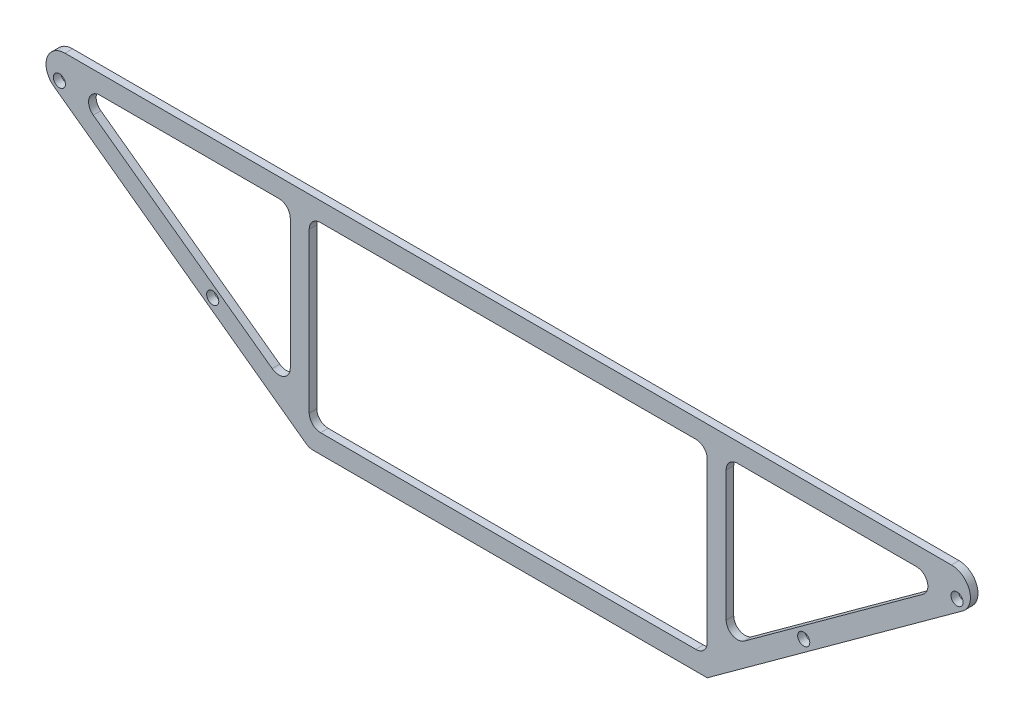
ISO-10303-21;
HEADER;
FILE_DESCRIPTION(('STEP AP214'),'2;1');
FILE_NAME('part.step','',(''),(''),'','','');
FILE_SCHEMA(('AUTOMOTIVE_DESIGN { 1 0 10303 214 1 1 1 1 }'));
ENDSEC;
DATA;
#1=APPLICATION_CONTEXT('core data for automotive mechanical design processes');
#2=APPLICATION_PROTOCOL_DEFINITION('international standard','automotive_design',2000,#1);
#3=PRODUCT_CONTEXT('',#1,'mechanical');
#4=PRODUCT('Part','Part','',(#3));
#5=PRODUCT_RELATED_PRODUCT_CATEGORY('part','',(#4));
#6=PRODUCT_DEFINITION_FORMATION('','',#4);
#7=PRODUCT_DEFINITION_CONTEXT('part definition',#1,'design');
#8=PRODUCT_DEFINITION('design','',#6,#7);
#9=PRODUCT_DEFINITION_SHAPE('','',#8);
#10=(LENGTH_UNIT() NAMED_UNIT(*) SI_UNIT(.MILLI.,.METRE.));
#11=(NAMED_UNIT(*) PLANE_ANGLE_UNIT() SI_UNIT($,.RADIAN.));
#12=(NAMED_UNIT(*) SI_UNIT($,.STERADIAN.) SOLID_ANGLE_UNIT());
#13=UNCERTAINTY_MEASURE_WITH_UNIT(LENGTH_MEASURE(1.E-05),#10,'distance_accuracy_value','');
#14=(GEOMETRIC_REPRESENTATION_CONTEXT(3) GLOBAL_UNCERTAINTY_ASSIGNED_CONTEXT((#13)) GLOBAL_UNIT_ASSIGNED_CONTEXT((#10,
#11,#12)) REPRESENTATION_CONTEXT('',''));
#15=CARTESIAN_POINT('',(0.,0.,0.));
#16=DIRECTION('',(0.,0.,1.));
#17=DIRECTION('',(1.,0.,0.));
#18=AXIS2_PLACEMENT_3D('',#15,#16,#17);
#19=CARTESIAN_POINT('',(-116.941733701452,23.9999999999999,2.));
#20=DIRECTION('',(0.,0.,1.));
#21=DIRECTION('',(1.,0.,0.));
#22=AXIS2_PLACEMENT_3D('',#19,#20,#21);
#23=PLANE('',#22);
#24=CARTESIAN_POINT('',(-118.411196832183,21.9774575140626,2.));
#25=DIRECTION('',(0.,0.,1.));
#26=DIRECTION('',(-1.,0.,0.));
#27=AXIS2_PLACEMENT_3D('',#24,#25,#26);
#28=CIRCLE('',#27,1.59999999999999);
#29=CARTESIAN_POINT('',(-120.011196832183,21.9774575140626,2.));
#30=VERTEX_POINT('',#29);
#31=EDGE_CURVE('E260',#30,#30,#28,.T.);
#32=ORIENTED_EDGE('',*,*,#31,.F.);
#33=EDGE_LOOP('',(#32));
#34=FACE_BOUND('',#33,.T.);
#35=CARTESIAN_POINT('',(118.411196832183,21.9774575140626,2.));
#36=DIRECTION('',(0.,0.,1.));
#37=DIRECTION('',(1.,0.,0.));
#38=AXIS2_PLACEMENT_3D('',#35,#36,#37);
#39=CIRCLE('',#38,1.59999999999999);
#40=CARTESIAN_POINT('',(120.011196832183,21.9774575140626,2.));
#41=VERTEX_POINT('',#40);
#42=EDGE_CURVE('E272',#41,#41,#39,.T.);
#43=ORIENTED_EDGE('',*,*,#42,.F.);
#44=EDGE_LOOP('',(#43));
#45=FACE_BOUND('',#44,.T.);
#46=DIRECTION('',(0.809016994374948,-0.587785252292472,0.));
#47=VECTOR('',#46,1.);
#48=CARTESIAN_POINT('',(-52.5,-29.,2.));
#49=LINE('',#48,#47);
#50=CARTESIAN_POINT('',(-119.880659962914,19.9549150281252,2.));
#51=VERTEX_POINT('',#50);
#52=CARTESIAN_POINT('',(-53.2885966681787,-28.4270509831249,2.));
#53=VERTEX_POINT('',#52);
#54=EDGE_CURVE('E348',#51,#53,#49,.T.);
#55=ORIENTED_EDGE('',*,*,#54,.T.);
#56=CARTESIAN_POINT('',(-51.5252409113013,-26.,2.));
#57=DIRECTION('',(0.,0.,1.));
#58=DIRECTION('',(1.,0.,0.));
#59=AXIS2_PLACEMENT_3D('',#56,#57,#58);
#60=CIRCLE('',#59,3.);
#61=CARTESIAN_POINT('',(-51.5252409113013,-29.,2.));
#62=VERTEX_POINT('',#61);
#63=EDGE_CURVE('E404',#53,#62,#60,.T.);
#64=ORIENTED_EDGE('',*,*,#63,.T.);
#65=DIRECTION('',(1.,0.,0.));
#66=VECTOR('',#65,1.);
#67=CARTESIAN_POINT('',(52.5,-29.,2.));
#68=LINE('',#67,#66);
#69=CARTESIAN_POINT('',(52.5,-29.,2.));
#70=VERTEX_POINT('',#69);
#71=EDGE_CURVE('E337',#62,#70,#68,.T.);
#72=ORIENTED_EDGE('',*,*,#71,.T.);
#73=DIRECTION('',(0.809016994374948,0.587785252292472,0.));
#74=VECTOR('',#73,1.);
#75=CARTESIAN_POINT('',(119.880659962914,19.9549150281252,2.));
#76=LINE('',#75,#74);
#77=CARTESIAN_POINT('',(119.880659962914,19.9549150281252,2.));
#78=VERTEX_POINT('',#77);
#79=EDGE_CURVE('E339',#70,#78,#76,.T.);
#80=ORIENTED_EDGE('',*,*,#79,.T.);
#81=CARTESIAN_POINT('',(116.941733701452,24.,2.));
#82=DIRECTION('',(0.,0.,1.));
#83=DIRECTION('',(-1.,0.,0.));
#84=AXIS2_PLACEMENT_3D('',#81,#82,#83);
#85=CIRCLE('',#84,4.99999999999999);
#86=CARTESIAN_POINT('',(116.941733701452,29.,2.));
#87=VERTEX_POINT('',#86);
#88=EDGE_CURVE('E342',#78,#87,#85,.T.);
#89=ORIENTED_EDGE('',*,*,#88,.T.);
#90=DIRECTION('',(-1.,0.,0.));
#91=VECTOR('',#90,1.);
#92=CARTESIAN_POINT('',(-116.941733701452,29.,2.));
#93=LINE('',#92,#91);
#94=CARTESIAN_POINT('',(-116.941733701452,29.,2.));
#95=VERTEX_POINT('',#94);
#96=EDGE_CURVE('E344',#87,#95,#93,.T.);
#97=ORIENTED_EDGE('',*,*,#96,.T.);
#98=CARTESIAN_POINT('',(-116.941733701452,23.9999999999999,2.));
#99=DIRECTION('',(0.,0.,1.));
#100=DIRECTION('',(1.,0.,0.));
#101=AXIS2_PLACEMENT_3D('',#98,#99,#100);
#102=CIRCLE('',#101,4.99999999999999);
#103=EDGE_CURVE('E346',#95,#51,#102,.T.);
#104=ORIENTED_EDGE('',*,*,#103,.T.);
#105=EDGE_LOOP('',(#55,#64,#72,#80,#89,#97,#104));
#106=FACE_BOUND('',#105,.T.);
#107=DIRECTION('',(1.,0.,0.));
#108=VECTOR('',#107,1.);
#109=CARTESIAN_POINT('',(52.5,-24.,2.));
#110=LINE('',#109,#108);
#111=CARTESIAN_POINT('',(-49.5,-24.,2.));
#112=VERTEX_POINT('',#111);
#113=CARTESIAN_POINT('',(49.5,-24.,2.));
#114=VERTEX_POINT('',#113);
#115=EDGE_CURVE('E316',#112,#114,#110,.T.);
#116=ORIENTED_EDGE('',*,*,#115,.F.);
#117=CARTESIAN_POINT('',(-49.5,-21.,2.));
#118=DIRECTION('',(0.,0.,1.));
#119=DIRECTION('',(1.,0.,0.));
#120=AXIS2_PLACEMENT_3D('',#117,#118,#119);
#121=CIRCLE('',#120,3.);
#122=CARTESIAN_POINT('',(-52.5,-21.,2.));
#123=VERTEX_POINT('',#122);
#124=EDGE_CURVE('E429',#112,#123,#121,.F.);
#125=ORIENTED_EDGE('',*,*,#124,.T.);
#126=DIRECTION('',(0.,-1.,0.));
#127=VECTOR('',#126,1.);
#128=CARTESIAN_POINT('',(-52.5,-24.,2.));
#129=LINE('',#128,#127);
#130=CARTESIAN_POINT('',(-52.5,21.,2.));
#131=VERTEX_POINT('',#130);
#132=EDGE_CURVE('E313',#131,#123,#129,.T.);
#133=ORIENTED_EDGE('',*,*,#132,.F.);
#134=CARTESIAN_POINT('',(-49.5,21.,2.));
#135=DIRECTION('',(0.,0.,1.));
#136=DIRECTION('',(1.,0.,0.));
#137=AXIS2_PLACEMENT_3D('',#134,#135,#136);
#138=CIRCLE('',#137,3.);
#139=CARTESIAN_POINT('',(-49.5,24.,2.));
#140=VERTEX_POINT('',#139);
#141=EDGE_CURVE('E433',#131,#140,#138,.F.);
#142=ORIENTED_EDGE('',*,*,#141,.T.);
#143=DIRECTION('',(-1.,0.,0.));
#144=VECTOR('',#143,1.);
#145=CARTESIAN_POINT('',(52.5,24.,2.));
#146=LINE('',#145,#144);
#147=CARTESIAN_POINT('',(49.5,24.,2.));
#148=VERTEX_POINT('',#147);
#149=EDGE_CURVE('E323',#148,#140,#146,.T.);
#150=ORIENTED_EDGE('',*,*,#149,.F.);
#151=CARTESIAN_POINT('',(49.5,21.,2.));
#152=DIRECTION('',(0.,0.,1.));
#153=DIRECTION('',(1.,0.,0.));
#154=AXIS2_PLACEMENT_3D('',#151,#152,#153);
#155=CIRCLE('',#154,3.);
#156=CARTESIAN_POINT('',(52.5,21.,2.));
#157=VERTEX_POINT('',#156);
#158=EDGE_CURVE('E425',#148,#157,#155,.F.);
#159=ORIENTED_EDGE('',*,*,#158,.T.);
#160=DIRECTION('',(0.,1.,0.));
#161=VECTOR('',#160,1.);
#162=CARTESIAN_POINT('',(52.5,-24.,2.));
#163=LINE('',#162,#161);
#164=CARTESIAN_POINT('',(52.5,-21.,2.));
#165=VERTEX_POINT('',#164);
#166=EDGE_CURVE('E320',#165,#157,#163,.T.);
#167=ORIENTED_EDGE('',*,*,#166,.F.);
#168=CARTESIAN_POINT('',(49.5,-21.,2.));
#169=DIRECTION('',(0.,0.,1.));
#170=DIRECTION('',(1.,0.,0.));
#171=AXIS2_PLACEMENT_3D('',#168,#169,#170);
#172=CIRCLE('',#171,3.);
#173=EDGE_CURVE('E421',#165,#114,#172,.F.);
#174=ORIENTED_EDGE('',*,*,#173,.T.);
#175=EDGE_LOOP('',(#116,#125,#133,#142,#150,#159,#167,#174));
#176=FACE_BOUND('',#175,.T.);
#177=CARTESIAN_POINT('',(60.5,21.,2.));
#178=DIRECTION('',(0.,0.,1.));
#179=DIRECTION('',(-1.,0.,0.));
#180=AXIS2_PLACEMENT_3D('',#177,#178,#179);
#181=CIRCLE('',#180,3.);
#182=CARTESIAN_POINT('',(60.5,24.,2.));
#183=VERTEX_POINT('',#182);
#184=CARTESIAN_POINT('',(57.5,21.,2.));
#185=VERTEX_POINT('',#184);
#186=EDGE_CURVE('E280',#183,#185,#181,.T.);
#187=ORIENTED_EDGE('',*,*,#186,.F.);
#188=DIRECTION('',(-1.,0.,0.));
#189=VECTOR('',#188,1.);
#190=CARTESIAN_POINT('',(116.941733701452,24.,2.));
#191=LINE('',#190,#189);
#192=CARTESIAN_POINT('',(107.708683089926,24.,2.));
#193=VERTEX_POINT('',#192);
#194=EDGE_CURVE('E278',#193,#183,#191,.T.);
#195=ORIENTED_EDGE('',*,*,#194,.F.);
#196=CARTESIAN_POINT('',(107.708683089926,21.,2.));
#197=DIRECTION('',(0.,0.,1.));
#198=DIRECTION('',(1.,0.,0.));
#199=AXIS2_PLACEMENT_3D('',#196,#197,#198);
#200=CIRCLE('',#199,3.);
#201=CARTESIAN_POINT('',(109.472038846804,18.5729490168751,2.));
#202=VERTEX_POINT('',#201);
#203=EDGE_CURVE('E417',#193,#202,#200,.F.);
#204=ORIENTED_EDGE('',*,*,#203,.T.);
#205=DIRECTION('',(0.809016994374948,0.587785252292472,0.));
#206=VECTOR('',#205,1.);
#207=CARTESIAN_POINT('',(62.2633557568774,-15.7261669390837,2.));
#208=LINE('',#207,#206);
#209=CARTESIAN_POINT('',(62.2633557568774,-15.7261669390837,2.));
#210=VERTEX_POINT('',#209);
#211=EDGE_CURVE('E288',#210,#202,#208,.T.);
#212=ORIENTED_EDGE('',*,*,#211,.F.);
#213=CARTESIAN_POINT('',(60.5,-13.2991159559589,2.));
#214=DIRECTION('',(0.,0.,1.));
#215=DIRECTION('',(1.,0.,0.));
#216=AXIS2_PLACEMENT_3D('',#213,#214,#215);
#217=CIRCLE('',#216,3.);
#218=CARTESIAN_POINT('',(57.5,-13.2991159559589,2.));
#219=VERTEX_POINT('',#218);
#220=EDGE_CURVE('E285',#219,#210,#217,.T.);
#221=ORIENTED_EDGE('',*,*,#220,.F.);
#222=DIRECTION('',(0.,-1.,0.));
#223=VECTOR('',#222,1.);
#224=CARTESIAN_POINT('',(57.5,21.,2.));
#225=LINE('',#224,#223);
#226=EDGE_CURVE('E283',#185,#219,#225,.T.);
#227=ORIENTED_EDGE('',*,*,#226,.F.);
#228=EDGE_LOOP('',(#187,#195,#204,#212,#221,#227));
#229=FACE_BOUND('',#228,.T.);
#230=CARTESIAN_POINT('',(77.9603471134358,-7.41180510056098,2.));
#231=DIRECTION('',(0.,0.,1.));
#232=DIRECTION('',(1.,0.,0.));
#233=AXIS2_PLACEMENT_3D('',#230,#231,#232);
#234=CIRCLE('',#233,1.59999999999995);
#235=CARTESIAN_POINT('',(79.5603471134357,-7.41180510056098,2.));
#236=VERTEX_POINT('',#235);
#237=EDGE_CURVE('E266',#236,#236,#234,.T.);
#238=ORIENTED_EDGE('',*,*,#237,.F.);
#239=EDGE_LOOP('',(#238));
#240=FACE_BOUND('',#239,.T.);
#241=CARTESIAN_POINT('',(-77.9603471134358,-7.411805100561,2.));
#242=DIRECTION('',(0.,0.,1.));
#243=DIRECTION('',(-1.,0.,0.));
#244=AXIS2_PLACEMENT_3D('',#241,#242,#243);
#245=CIRCLE('',#244,1.59999999999996);
#246=CARTESIAN_POINT('',(-79.5603471134357,-7.411805100561,2.));
#247=VERTEX_POINT('',#246);
#248=EDGE_CURVE('E254',#247,#247,#245,.T.);
#249=ORIENTED_EDGE('',*,*,#248,.F.);
#250=EDGE_LOOP('',(#249));
#251=FACE_BOUND('',#250,.T.);
#252=DIRECTION('',(0.809016994374948,-0.587785252292472,0.));
#253=VECTOR('',#252,1.);
#254=CARTESIAN_POINT('',(-62.2633557568774,-15.7261669390837,2.));
#255=LINE('',#254,#253);
#256=CARTESIAN_POINT('',(-109.472038846804,18.5729490168751,2.));
#257=VERTEX_POINT('',#256);
#258=CARTESIAN_POINT('',(-62.2633557568774,-15.7261669390837,2.));
#259=VERTEX_POINT('',#258);
#260=EDGE_CURVE('E209',#257,#259,#255,.T.);
#261=ORIENTED_EDGE('',*,*,#260,.F.);
#262=CARTESIAN_POINT('',(-107.708683089926,21.,2.));
#263=DIRECTION('',(0.,0.,1.));
#264=DIRECTION('',(1.,0.,0.));
#265=AXIS2_PLACEMENT_3D('',#262,#263,#264);
#266=CIRCLE('',#265,3.);
#267=CARTESIAN_POINT('',(-107.708683089926,23.9999999999999,2.));
#268=VERTEX_POINT('',#267);
#269=EDGE_CURVE('E11',#257,#268,#266,.F.);
#270=ORIENTED_EDGE('',*,*,#269,.T.);
#271=DIRECTION('',(-1.,0.,0.));
#272=VECTOR('',#271,1.);
#273=CARTESIAN_POINT('',(-116.941733701452,23.9999999999999,2.));
#274=LINE('',#273,#272);
#275=CARTESIAN_POINT('',(-60.5,24.,2.));
#276=VERTEX_POINT('',#275);
#277=EDGE_CURVE('E216',#276,#268,#274,.T.);
#278=ORIENTED_EDGE('',*,*,#277,.F.);
#279=CARTESIAN_POINT('',(-60.5,21.,2.));
#280=DIRECTION('',(0.,0.,1.));
#281=DIRECTION('',(1.,0.,0.));
#282=AXIS2_PLACEMENT_3D('',#279,#280,#281);
#283=CIRCLE('',#282,3.);
#284=CARTESIAN_POINT('',(-57.5,21.,2.));
#285=VERTEX_POINT('',#284);
#286=EDGE_CURVE('E231',#285,#276,#283,.T.);
#287=ORIENTED_EDGE('',*,*,#286,.F.);
#288=DIRECTION('',(0.,1.,0.));
#289=VECTOR('',#288,1.);
#290=CARTESIAN_POINT('',(-57.5,21.,2.));
#291=LINE('',#290,#289);
#292=CARTESIAN_POINT('',(-57.5,-13.2991159559589,2.));
#293=VERTEX_POINT('',#292);
#294=EDGE_CURVE('E229',#293,#285,#291,.T.);
#295=ORIENTED_EDGE('',*,*,#294,.F.);
#296=CARTESIAN_POINT('',(-60.5,-13.2991159559589,2.));
#297=DIRECTION('',(0.,0.,1.));
#298=DIRECTION('',(-1.,0.,0.));
#299=AXIS2_PLACEMENT_3D('',#296,#297,#298);
#300=CIRCLE('',#299,3.);
#301=EDGE_CURVE('E215',#259,#293,#300,.T.);
#302=ORIENTED_EDGE('',*,*,#301,.F.);
#303=EDGE_LOOP('',(#261,#270,#278,#287,#295,#302));
#304=FACE_BOUND('',#303,.T.);
#305=ADVANCED_FACE('F32',(#34,#45,#106,#176,#229,#240,#251,#304),#23,.T.);
#306=CARTESIAN_POINT('',(-116.941733701452,23.9999999999999,0.));
#307=DIRECTION('',(0.,0.,1.));
#308=DIRECTION('',(1.,0.,0.));
#309=AXIS2_PLACEMENT_3D('',#306,#307,#308);
#310=PLANE('',#309);
#311=CARTESIAN_POINT('',(-77.9603471134358,-7.411805100561,0.));
#312=DIRECTION('',(0.,0.,1.));
#313=DIRECTION('',(-1.,0.,0.));
#314=AXIS2_PLACEMENT_3D('',#311,#312,#313);
#315=CIRCLE('',#314,1.59999999999996);
#316=CARTESIAN_POINT('',(-79.5603471134357,-7.411805100561,0.));
#317=VERTEX_POINT('',#316);
#318=EDGE_CURVE('E223',#317,#317,#315,.T.);
#319=ORIENTED_EDGE('',*,*,#318,.T.);
#320=EDGE_LOOP('',(#319));
#321=FACE_BOUND('',#320,.T.);
#322=CARTESIAN_POINT('',(-118.411196832183,21.9774575140626,0.));
#323=DIRECTION('',(0.,0.,1.));
#324=DIRECTION('',(-1.,0.,0.));
#325=AXIS2_PLACEMENT_3D('',#322,#323,#324);
#326=CIRCLE('',#325,1.59999999999999);
#327=CARTESIAN_POINT('',(-120.011196832183,21.9774575140626,0.));
#328=VERTEX_POINT('',#327);
#329=EDGE_CURVE('E257',#328,#328,#326,.T.);
#330=ORIENTED_EDGE('',*,*,#329,.T.);
#331=EDGE_LOOP('',(#330));
#332=FACE_BOUND('',#331,.T.);
#333=CARTESIAN_POINT('',(77.9603471134358,-7.41180510056098,0.));
#334=DIRECTION('',(0.,0.,1.));
#335=DIRECTION('',(1.,0.,0.));
#336=AXIS2_PLACEMENT_3D('',#333,#334,#335);
#337=CIRCLE('',#336,1.59999999999995);
#338=CARTESIAN_POINT('',(79.5603471134357,-7.41180510056098,0.));
#339=VERTEX_POINT('',#338);
#340=EDGE_CURVE('E263',#339,#339,#337,.T.);
#341=ORIENTED_EDGE('',*,*,#340,.T.);
#342=EDGE_LOOP('',(#341));
#343=FACE_BOUND('',#342,.T.);
#344=CARTESIAN_POINT('',(118.411196832183,21.9774575140626,0.));
#345=DIRECTION('',(0.,0.,1.));
#346=DIRECTION('',(1.,0.,0.));
#347=AXIS2_PLACEMENT_3D('',#344,#345,#346);
#348=CIRCLE('',#347,1.59999999999999);
#349=CARTESIAN_POINT('',(120.011196832183,21.9774575140626,0.));
#350=VERTEX_POINT('',#349);
#351=EDGE_CURVE('E269',#350,#350,#348,.T.);
#352=ORIENTED_EDGE('',*,*,#351,.T.);
#353=EDGE_LOOP('',(#352));
#354=FACE_BOUND('',#353,.T.);
#355=DIRECTION('',(0.809016994374948,0.587785252292472,0.));
#356=VECTOR('',#355,1.);
#357=CARTESIAN_POINT('',(62.2633557568774,-15.7261669390837,0.));
#358=LINE('',#357,#356);
#359=CARTESIAN_POINT('',(62.2633557568774,-15.7261669390837,0.));
#360=VERTEX_POINT('',#359);
#361=CARTESIAN_POINT('',(109.472038846804,18.5729490168751,0.));
#362=VERTEX_POINT('',#361);
#363=EDGE_CURVE('E281',#360,#362,#358,.T.);
#364=ORIENTED_EDGE('',*,*,#363,.T.);
#365=CARTESIAN_POINT('',(107.708683089926,21.,0.));
#366=DIRECTION('',(0.,0.,1.));
#367=DIRECTION('',(1.,0.,0.));
#368=AXIS2_PLACEMENT_3D('',#365,#366,#367);
#369=CIRCLE('',#368,3.);
#370=CARTESIAN_POINT('',(107.708683089926,24.,0.));
#371=VERTEX_POINT('',#370);
#372=EDGE_CURVE('E415',#362,#371,#369,.T.);
#373=ORIENTED_EDGE('',*,*,#372,.T.);
#374=DIRECTION('',(-1.,0.,0.));
#375=VECTOR('',#374,1.);
#376=CARTESIAN_POINT('',(116.941733701452,24.,0.));
#377=LINE('',#376,#375);
#378=CARTESIAN_POINT('',(60.5,24.,0.));
#379=VERTEX_POINT('',#378);
#380=EDGE_CURVE('E275',#371,#379,#377,.T.);
#381=ORIENTED_EDGE('',*,*,#380,.T.);
#382=CARTESIAN_POINT('',(60.5,21.,0.));
#383=DIRECTION('',(0.,0.,1.));
#384=DIRECTION('',(-1.,0.,0.));
#385=AXIS2_PLACEMENT_3D('',#382,#383,#384);
#386=CIRCLE('',#385,3.);
#387=CARTESIAN_POINT('',(57.5,21.,0.));
#388=VERTEX_POINT('',#387);
#389=EDGE_CURVE('E293',#379,#388,#386,.T.);
#390=ORIENTED_EDGE('',*,*,#389,.T.);
#391=DIRECTION('',(0.,-1.,0.));
#392=VECTOR('',#391,1.);
#393=CARTESIAN_POINT('',(57.5,21.,0.));
#394=LINE('',#393,#392);
#395=CARTESIAN_POINT('',(57.5,-13.2991159559589,0.));
#396=VERTEX_POINT('',#395);
#397=EDGE_CURVE('E296',#388,#396,#394,.T.);
#398=ORIENTED_EDGE('',*,*,#397,.T.);
#399=CARTESIAN_POINT('',(60.5,-13.2991159559589,0.));
#400=DIRECTION('',(0.,0.,1.));
#401=DIRECTION('',(1.,0.,0.));
#402=AXIS2_PLACEMENT_3D('',#399,#400,#401);
#403=CIRCLE('',#402,3.);
#404=EDGE_CURVE('E299',#396,#360,#403,.T.);
#405=ORIENTED_EDGE('',*,*,#404,.T.);
#406=EDGE_LOOP('',(#364,#373,#381,#390,#398,#405));
#407=FACE_BOUND('',#406,.T.);
#408=DIRECTION('',(1.,0.,0.));
#409=VECTOR('',#408,1.);
#410=CARTESIAN_POINT('',(52.5,-29.,0.));
#411=LINE('',#410,#409);
#412=CARTESIAN_POINT('',(-51.5252409113013,-29.,0.));
#413=VERTEX_POINT('',#412);
#414=CARTESIAN_POINT('',(52.5,-29.,0.));
#415=VERTEX_POINT('',#414);
#416=EDGE_CURVE('E326',#413,#415,#411,.T.);
#417=ORIENTED_EDGE('',*,*,#416,.F.);
#418=CARTESIAN_POINT('',(-51.5252409113013,-26.,0.));
#419=DIRECTION('',(0.,0.,1.));
#420=DIRECTION('',(1.,0.,0.));
#421=AXIS2_PLACEMENT_3D('',#418,#419,#420);
#422=CIRCLE('',#421,3.);
#423=CARTESIAN_POINT('',(-53.2885966681787,-28.4270509831249,0.));
#424=VERTEX_POINT('',#423);
#425=EDGE_CURVE('E400',#413,#424,#422,.F.);
#426=ORIENTED_EDGE('',*,*,#425,.T.);
#427=DIRECTION('',(0.809016994374948,-0.587785252292472,0.));
#428=VECTOR('',#427,1.);
#429=CARTESIAN_POINT('',(-52.5,-29.,0.));
#430=LINE('',#429,#428);
#431=CARTESIAN_POINT('',(-119.880659962914,19.9549150281252,0.));
#432=VERTEX_POINT('',#431);
#433=EDGE_CURVE('E340',#432,#424,#430,.T.);
#434=ORIENTED_EDGE('',*,*,#433,.F.);
#435=CARTESIAN_POINT('',(-116.941733701452,23.9999999999999,0.));
#436=DIRECTION('',(0.,0.,1.));
#437=DIRECTION('',(1.,0.,0.));
#438=AXIS2_PLACEMENT_3D('',#435,#436,#437);
#439=CIRCLE('',#438,4.99999999999999);
#440=CARTESIAN_POINT('',(-116.941733701452,29.,0.));
#441=VERTEX_POINT('',#440);
#442=EDGE_CURVE('E359',#441,#432,#439,.T.);
#443=ORIENTED_EDGE('',*,*,#442,.F.);
#444=DIRECTION('',(-1.,0.,0.));
#445=VECTOR('',#444,1.);
#446=CARTESIAN_POINT('',(-116.941733701452,29.,0.));
#447=LINE('',#446,#445);
#448=CARTESIAN_POINT('',(116.941733701452,29.,0.));
#449=VERTEX_POINT('',#448);
#450=EDGE_CURVE('E357',#449,#441,#447,.T.);
#451=ORIENTED_EDGE('',*,*,#450,.F.);
#452=CARTESIAN_POINT('',(116.941733701452,24.,0.));
#453=DIRECTION('',(0.,0.,1.));
#454=DIRECTION('',(-1.,0.,0.));
#455=AXIS2_PLACEMENT_3D('',#452,#453,#454);
#456=CIRCLE('',#455,4.99999999999999);
#457=CARTESIAN_POINT('',(119.880659962914,19.9549150281252,0.));
#458=VERTEX_POINT('',#457);
#459=EDGE_CURVE('E355',#458,#449,#456,.T.);
#460=ORIENTED_EDGE('',*,*,#459,.F.);
#461=DIRECTION('',(0.809016994374948,0.587785252292472,0.));
#462=VECTOR('',#461,1.);
#463=CARTESIAN_POINT('',(119.880659962914,19.9549150281252,0.));
#464=LINE('',#463,#462);
#465=EDGE_CURVE('E353',#415,#458,#464,.T.);
#466=ORIENTED_EDGE('',*,*,#465,.F.);
#467=EDGE_LOOP('',(#417,#426,#434,#443,#451,#460,#466));
#468=FACE_BOUND('',#467,.T.);
#469=DIRECTION('',(-1.,0.,0.));
#470=VECTOR('',#469,1.);
#471=CARTESIAN_POINT('',(52.5,24.,0.));
#472=LINE('',#471,#470);
#473=CARTESIAN_POINT('',(49.5,24.,0.));
#474=VERTEX_POINT('',#473);
#475=CARTESIAN_POINT('',(-49.5,24.,0.));
#476=VERTEX_POINT('',#475);
#477=EDGE_CURVE('E317',#474,#476,#472,.T.);
#478=ORIENTED_EDGE('',*,*,#477,.T.);
#479=CARTESIAN_POINT('',(-49.5,21.,0.));
#480=DIRECTION('',(0.,0.,1.));
#481=DIRECTION('',(1.,0.,0.));
#482=AXIS2_PLACEMENT_3D('',#479,#480,#481);
#483=CIRCLE('',#482,3.);
#484=CARTESIAN_POINT('',(-52.5,21.,0.));
#485=VERTEX_POINT('',#484);
#486=EDGE_CURVE('E431',#476,#485,#483,.T.);
#487=ORIENTED_EDGE('',*,*,#486,.T.);
#488=DIRECTION('',(0.,-1.,0.));
#489=VECTOR('',#488,1.);
#490=CARTESIAN_POINT('',(-52.5,-24.,0.));
#491=LINE('',#490,#489);
#492=CARTESIAN_POINT('',(-52.5,-21.,0.));
#493=VERTEX_POINT('',#492);
#494=EDGE_CURVE('E312',#485,#493,#491,.T.);
#495=ORIENTED_EDGE('',*,*,#494,.T.);
#496=CARTESIAN_POINT('',(-49.5,-21.,0.));
#497=DIRECTION('',(0.,0.,1.));
#498=DIRECTION('',(1.,0.,0.));
#499=AXIS2_PLACEMENT_3D('',#496,#497,#498);
#500=CIRCLE('',#499,3.);
#501=CARTESIAN_POINT('',(-49.5,-24.,0.));
#502=VERTEX_POINT('',#501);
#503=EDGE_CURVE('E427',#493,#502,#500,.T.);
#504=ORIENTED_EDGE('',*,*,#503,.T.);
#505=DIRECTION('',(1.,0.,0.));
#506=VECTOR('',#505,1.);
#507=CARTESIAN_POINT('',(52.5,-24.,0.));
#508=LINE('',#507,#506);
#509=CARTESIAN_POINT('',(49.5,-24.,0.));
#510=VERTEX_POINT('',#509);
#511=EDGE_CURVE('E329',#502,#510,#508,.T.);
#512=ORIENTED_EDGE('',*,*,#511,.T.);
#513=CARTESIAN_POINT('',(49.5,-21.,0.));
#514=DIRECTION('',(0.,0.,1.));
#515=DIRECTION('',(1.,0.,0.));
#516=AXIS2_PLACEMENT_3D('',#513,#514,#515);
#517=CIRCLE('',#516,3.);
#518=CARTESIAN_POINT('',(52.5,-21.,0.));
#519=VERTEX_POINT('',#518);
#520=EDGE_CURVE('E419',#510,#519,#517,.T.);
#521=ORIENTED_EDGE('',*,*,#520,.T.);
#522=DIRECTION('',(0.,1.,0.));
#523=VECTOR('',#522,1.);
#524=CARTESIAN_POINT('',(52.5,-24.,0.));
#525=LINE('',#524,#523);
#526=CARTESIAN_POINT('',(52.5,21.,0.));
#527=VERTEX_POINT('',#526);
#528=EDGE_CURVE('E332',#519,#527,#525,.T.);
#529=ORIENTED_EDGE('',*,*,#528,.T.);
#530=CARTESIAN_POINT('',(49.5,21.,0.));
#531=DIRECTION('',(0.,0.,1.));
#532=DIRECTION('',(1.,0.,0.));
#533=AXIS2_PLACEMENT_3D('',#530,#531,#532);
#534=CIRCLE('',#533,3.);
#535=EDGE_CURVE('E423',#527,#474,#534,.T.);
#536=ORIENTED_EDGE('',*,*,#535,.T.);
#537=EDGE_LOOP('',(#478,#487,#495,#504,#512,#521,#529,#536));
#538=FACE_BOUND('',#537,.T.);
#539=DIRECTION('',(-1.,0.,0.));
#540=VECTOR('',#539,1.);
#541=CARTESIAN_POINT('',(-116.941733701452,23.9999999999999,0.));
#542=LINE('',#541,#540);
#543=CARTESIAN_POINT('',(-60.5,24.,0.));
#544=VERTEX_POINT('',#543);
#545=CARTESIAN_POINT('',(-107.708683089926,23.9999999999999,0.));
#546=VERTEX_POINT('',#545);
#547=EDGE_CURVE('E237',#544,#546,#542,.T.);
#548=ORIENTED_EDGE('',*,*,#547,.T.);
#549=CARTESIAN_POINT('',(-107.708683089926,21.,0.));
#550=DIRECTION('',(0.,0.,1.));
#551=DIRECTION('',(1.,0.,0.));
#552=AXIS2_PLACEMENT_3D('',#549,#550,#551);
#553=CIRCLE('',#552,3.);
#554=CARTESIAN_POINT('',(-109.472038846804,18.5729490168751,0.));
#555=VERTEX_POINT('',#554);
#556=EDGE_CURVE('E40',#546,#555,#553,.T.);
#557=ORIENTED_EDGE('',*,*,#556,.T.);
#558=DIRECTION('',(0.809016994374948,-0.587785252292472,0.));
#559=VECTOR('',#558,1.);
#560=CARTESIAN_POINT('',(-62.2633557568774,-15.7261669390837,0.));
#561=LINE('',#560,#559);
#562=CARTESIAN_POINT('',(-62.2633557568774,-15.7261669390837,0.));
#563=VERTEX_POINT('',#562);
#564=EDGE_CURVE('E240',#555,#563,#561,.T.);
#565=ORIENTED_EDGE('',*,*,#564,.T.);
#566=CARTESIAN_POINT('',(-60.5,-13.2991159559589,0.));
#567=DIRECTION('',(0.,0.,1.));
#568=DIRECTION('',(-1.,0.,0.));
#569=AXIS2_PLACEMENT_3D('',#566,#567,#568);
#570=CIRCLE('',#569,3.);
#571=CARTESIAN_POINT('',(-57.5,-13.2991159559589,0.));
#572=VERTEX_POINT('',#571);
#573=EDGE_CURVE('E222',#563,#572,#570,.T.);
#574=ORIENTED_EDGE('',*,*,#573,.T.);
#575=DIRECTION('',(0.,1.,0.));
#576=VECTOR('',#575,1.);
#577=CARTESIAN_POINT('',(-57.5,21.,0.));
#578=LINE('',#577,#576);
#579=CARTESIAN_POINT('',(-57.5,21.,0.));
#580=VERTEX_POINT('',#579);
#581=EDGE_CURVE('E243',#572,#580,#578,.T.);
#582=ORIENTED_EDGE('',*,*,#581,.T.);
#583=CARTESIAN_POINT('',(-60.5,21.,0.));
#584=DIRECTION('',(0.,0.,1.));
#585=DIRECTION('',(1.,0.,0.));
#586=AXIS2_PLACEMENT_3D('',#583,#584,#585);
#587=CIRCLE('',#586,3.);
#588=EDGE_CURVE('E246',#580,#544,#587,.T.);
#589=ORIENTED_EDGE('',*,*,#588,.T.);
#590=EDGE_LOOP('',(#548,#557,#565,#574,#582,#589));
#591=FACE_BOUND('',#590,.T.);
#592=ADVANCED_FACE('F435',(#321,#332,#343,#354,#407,#468,#538,#591),#310,.F.);
#593=CARTESIAN_POINT('',(52.5,-29.,2.));
#594=DIRECTION('',(0.,1.,0.));
#595=DIRECTION('',(-1.,0.,0.));
#596=AXIS2_PLACEMENT_3D('',#593,#594,#595);
#597=PLANE('',#596);
#598=ORIENTED_EDGE('',*,*,#71,.F.);
#599=DIRECTION('',(0.,0.,-1.));
#600=VECTOR('',#599,1.);
#601=CARTESIAN_POINT('',(-51.5252409113013,-29.,2.));
#602=LINE('',#601,#600);
#603=EDGE_CURVE('E397',#62,#413,#602,.T.);
#604=ORIENTED_EDGE('',*,*,#603,.T.);
#605=ORIENTED_EDGE('',*,*,#416,.T.);
#606=DIRECTION('',(0.,0.,-1.));
#607=VECTOR('',#606,1.);
#608=CARTESIAN_POINT('',(52.5,-29.,2.));
#609=LINE('',#608,#607);
#610=EDGE_CURVE('E374',#70,#415,#609,.T.);
#611=ORIENTED_EDGE('',*,*,#610,.F.);
#612=EDGE_LOOP('',(#598,#604,#605,#611));
#613=FACE_BOUND('',#612,.T.);
#614=ADVANCED_FACE('F462',(#613),#597,.F.);
#615=CARTESIAN_POINT('',(119.880659962914,19.9549150281252,2.));
#616=DIRECTION('',(-0.587785252292472,0.809016994374948,0.));
#617=DIRECTION('',(-0.809016994374948,-0.587785252292472,0.));
#618=AXIS2_PLACEMENT_3D('',#615,#616,#617);
#619=PLANE('',#618);
#620=ORIENTED_EDGE('',*,*,#465,.T.);
#621=DIRECTION('',(0.,0.,-1.));
#622=VECTOR('',#621,1.);
#623=CARTESIAN_POINT('',(119.880659962914,19.9549150281252,2.));
#624=LINE('',#623,#622);
#625=EDGE_CURVE('E371',#78,#458,#624,.T.);
#626=ORIENTED_EDGE('',*,*,#625,.F.);
#627=ORIENTED_EDGE('',*,*,#79,.F.);
#628=ORIENTED_EDGE('',*,*,#610,.T.);
#629=EDGE_LOOP('',(#620,#626,#627,#628));
#630=FACE_BOUND('',#629,.T.);
#631=ADVANCED_FACE('F486',(#630),#619,.F.);
#632=CARTESIAN_POINT('',(116.941733701452,24.,2.));
#633=DIRECTION('',(0.,0.,-1.));
#634=DIRECTION('',(-1.,0.,0.));
#635=AXIS2_PLACEMENT_3D('',#632,#633,#634);
#636=CYLINDRICAL_SURFACE('',#635,4.99999999999999);
#637=ORIENTED_EDGE('',*,*,#459,.T.);
#638=DIRECTION('',(0.,0.,-1.));
#639=VECTOR('',#638,1.);
#640=CARTESIAN_POINT('',(116.941733701452,29.,2.));
#641=LINE('',#640,#639);
#642=EDGE_CURVE('E368',#87,#449,#641,.T.);
#643=ORIENTED_EDGE('',*,*,#642,.F.);
#644=ORIENTED_EDGE('',*,*,#88,.F.);
#645=ORIENTED_EDGE('',*,*,#625,.T.);
#646=EDGE_LOOP('',(#637,#643,#644,#645));
#647=FACE_BOUND('',#646,.T.);
#648=ADVANCED_FACE('F482',(#647),#636,.T.);
#649=CARTESIAN_POINT('',(-116.941733701452,29.,2.));
#650=DIRECTION('',(0.,-1.,0.));
#651=DIRECTION('',(1.,0.,0.));
#652=AXIS2_PLACEMENT_3D('',#649,#650,#651);
#653=PLANE('',#652);
#654=ORIENTED_EDGE('',*,*,#450,.T.);
#655=DIRECTION('',(0.,0.,-1.));
#656=VECTOR('',#655,1.);
#657=CARTESIAN_POINT('',(-116.941733701452,29.,2.));
#658=LINE('',#657,#656);
#659=EDGE_CURVE('E365',#95,#441,#658,.T.);
#660=ORIENTED_EDGE('',*,*,#659,.F.);
#661=ORIENTED_EDGE('',*,*,#96,.F.);
#662=ORIENTED_EDGE('',*,*,#642,.T.);
#663=EDGE_LOOP('',(#654,#660,#661,#662));
#664=FACE_BOUND('',#663,.T.);
#665=ADVANCED_FACE('F478',(#664),#653,.F.);
#666=CARTESIAN_POINT('',(-116.941733701452,23.9999999999999,2.));
#667=DIRECTION('',(0.,0.,-1.));
#668=DIRECTION('',(-1.,0.,0.));
#669=AXIS2_PLACEMENT_3D('',#666,#667,#668);
#670=CYLINDRICAL_SURFACE('',#669,4.99999999999999);
#671=ORIENTED_EDGE('',*,*,#442,.T.);
#672=DIRECTION('',(0.,0.,-1.));
#673=VECTOR('',#672,1.);
#674=CARTESIAN_POINT('',(-119.880659962914,19.9549150281252,2.));
#675=LINE('',#674,#673);
#676=EDGE_CURVE('E351',#51,#432,#675,.T.);
#677=ORIENTED_EDGE('',*,*,#676,.F.);
#678=ORIENTED_EDGE('',*,*,#103,.F.);
#679=ORIENTED_EDGE('',*,*,#659,.T.);
#680=EDGE_LOOP('',(#671,#677,#678,#679));
#681=FACE_BOUND('',#680,.T.);
#682=ADVANCED_FACE('F474',(#681),#670,.T.);
#683=CARTESIAN_POINT('',(-52.5,-29.,2.));
#684=DIRECTION('',(0.587785252292472,0.809016994374948,0.));
#685=DIRECTION('',(-0.809016994374949,0.587785252292472,0.));
#686=AXIS2_PLACEMENT_3D('',#683,#684,#685);
#687=PLANE('',#686);
#688=ORIENTED_EDGE('',*,*,#433,.T.);
#689=DIRECTION('',(0.,0.,-1.));
#690=VECTOR('',#689,1.);
#691=CARTESIAN_POINT('',(-53.2885966681787,-28.4270509831249,2.));
#692=LINE('',#691,#690);
#693=EDGE_CURVE('E402',#424,#53,#692,.F.);
#694=ORIENTED_EDGE('',*,*,#693,.T.);
#695=ORIENTED_EDGE('',*,*,#54,.F.);
#696=ORIENTED_EDGE('',*,*,#676,.T.);
#697=EDGE_LOOP('',(#688,#694,#695,#696));
#698=FACE_BOUND('',#697,.T.);
#699=ADVANCED_FACE('F471',(#698),#687,.F.);
#700=CARTESIAN_POINT('',(-52.5,-24.,2.));
#701=DIRECTION('',(1.,0.,0.));
#702=DIRECTION('',(0.,0.,-1.));
#703=AXIS2_PLACEMENT_3D('',#700,#701,#702);
#704=PLANE('',#703);
#705=ORIENTED_EDGE('',*,*,#132,.T.);
#706=DIRECTION('',(0.,0.,-1.));
#707=VECTOR('',#706,1.);
#708=CARTESIAN_POINT('',(-52.5,-21.,0.));
#709=LINE('',#708,#707);
#710=EDGE_CURVE('E408',#123,#493,#709,.T.);
#711=ORIENTED_EDGE('',*,*,#710,.T.);
#712=ORIENTED_EDGE('',*,*,#494,.F.);
#713=DIRECTION('',(0.,0.,-1.));
#714=VECTOR('',#713,1.);
#715=CARTESIAN_POINT('',(-52.5,21.,2.));
#716=LINE('',#715,#714);
#717=EDGE_CURVE('E406',#485,#131,#716,.F.);
#718=ORIENTED_EDGE('',*,*,#717,.T.);
#719=EDGE_LOOP('',(#705,#711,#712,#718));
#720=FACE_BOUND('',#719,.T.);
#721=ADVANCED_FACE('F468',(#720),#704,.T.);
#722=CARTESIAN_POINT('',(52.5,-24.,2.));
#723=DIRECTION('',(0.,1.,0.));
#724=DIRECTION('',(-1.,0.,0.));
#725=AXIS2_PLACEMENT_3D('',#722,#723,#724);
#726=PLANE('',#725);
#727=ORIENTED_EDGE('',*,*,#115,.T.);
#728=DIRECTION('',(0.,0.,-1.));
#729=VECTOR('',#728,1.);
#730=CARTESIAN_POINT('',(49.5,-24.,0.));
#731=LINE('',#730,#729);
#732=EDGE_CURVE('E384',#114,#510,#731,.T.);
#733=ORIENTED_EDGE('',*,*,#732,.T.);
#734=ORIENTED_EDGE('',*,*,#511,.F.);
#735=DIRECTION('',(0.,0.,-1.));
#736=VECTOR('',#735,1.);
#737=CARTESIAN_POINT('',(-49.5,-24.,2.));
#738=LINE('',#737,#736);
#739=EDGE_CURVE('E382',#502,#112,#738,.F.);
#740=ORIENTED_EDGE('',*,*,#739,.T.);
#741=EDGE_LOOP('',(#727,#733,#734,#740));
#742=FACE_BOUND('',#741,.T.);
#743=ADVANCED_FACE('F541',(#742),#726,.T.);
#744=CARTESIAN_POINT('',(52.5,-24.,2.));
#745=DIRECTION('',(-1.,0.,0.));
#746=DIRECTION('',(0.,-1.,0.));
#747=AXIS2_PLACEMENT_3D('',#744,#745,#746);
#748=PLANE('',#747);
#749=ORIENTED_EDGE('',*,*,#528,.F.);
#750=DIRECTION('',(0.,0.,-1.));
#751=VECTOR('',#750,1.);
#752=CARTESIAN_POINT('',(52.5,-21.,2.));
#753=LINE('',#752,#751);
#754=EDGE_CURVE('E390',#519,#165,#753,.F.);
#755=ORIENTED_EDGE('',*,*,#754,.T.);
#756=ORIENTED_EDGE('',*,*,#166,.T.);
#757=DIRECTION('',(0.,0.,-1.));
#758=VECTOR('',#757,1.);
#759=CARTESIAN_POINT('',(52.5,21.,0.));
#760=LINE('',#759,#758);
#761=EDGE_CURVE('E387',#157,#527,#760,.T.);
#762=ORIENTED_EDGE('',*,*,#761,.T.);
#763=EDGE_LOOP('',(#749,#755,#756,#762));
#764=FACE_BOUND('',#763,.T.);
#765=ADVANCED_FACE('F536',(#764),#748,.T.);
#766=CARTESIAN_POINT('',(52.5,24.,2.));
#767=DIRECTION('',(0.,-1.,0.));
#768=DIRECTION('',(1.,0.,0.));
#769=AXIS2_PLACEMENT_3D('',#766,#767,#768);
#770=PLANE('',#769);
#771=ORIENTED_EDGE('',*,*,#477,.F.);
#772=DIRECTION('',(0.,0.,-1.));
#773=VECTOR('',#772,1.);
#774=CARTESIAN_POINT('',(49.5,24.,2.));
#775=LINE('',#774,#773);
#776=EDGE_CURVE('E395',#474,#148,#775,.F.);
#777=ORIENTED_EDGE('',*,*,#776,.T.);
#778=ORIENTED_EDGE('',*,*,#149,.T.);
#779=DIRECTION('',(0.,0.,-1.));
#780=VECTOR('',#779,1.);
#781=CARTESIAN_POINT('',(-49.5,24.,0.));
#782=LINE('',#781,#780);
#783=EDGE_CURVE('E392',#140,#476,#782,.T.);
#784=ORIENTED_EDGE('',*,*,#783,.T.);
#785=EDGE_LOOP('',(#771,#777,#778,#784));
#786=FACE_BOUND('',#785,.T.);
#787=ADVANCED_FACE('F529',(#786),#770,.T.);
#788=CARTESIAN_POINT('',(116.941733701452,24.,2.));
#789=DIRECTION('',(0.,-1.,0.));
#790=DIRECTION('',(1.,0.,0.));
#791=AXIS2_PLACEMENT_3D('',#788,#789,#790);
#792=PLANE('',#791);
#793=ORIENTED_EDGE('',*,*,#380,.F.);
#794=DIRECTION('',(0.,0.,-1.));
#795=VECTOR('',#794,1.);
#796=CARTESIAN_POINT('',(107.708683089926,24.,2.));
#797=LINE('',#796,#795);
#798=EDGE_CURVE('E380',#371,#193,#797,.F.);
#799=ORIENTED_EDGE('',*,*,#798,.T.);
#800=ORIENTED_EDGE('',*,*,#194,.T.);
#801=DIRECTION('',(0.,0.,-1.));
#802=VECTOR('',#801,1.);
#803=CARTESIAN_POINT('',(60.5,24.,2.));
#804=LINE('',#803,#802);
#805=EDGE_CURVE('E309',#183,#379,#804,.T.);
#806=ORIENTED_EDGE('',*,*,#805,.T.);
#807=EDGE_LOOP('',(#793,#799,#800,#806));
#808=FACE_BOUND('',#807,.T.);
#809=ADVANCED_FACE('F559',(#808),#792,.T.);
#810=CARTESIAN_POINT('',(60.5,21.,2.));
#811=DIRECTION('',(0.,0.,-1.));
#812=DIRECTION('',(-1.,0.,0.));
#813=AXIS2_PLACEMENT_3D('',#810,#811,#812);
#814=CYLINDRICAL_SURFACE('',#813,3.);
#815=ORIENTED_EDGE('',*,*,#389,.F.);
#816=ORIENTED_EDGE('',*,*,#805,.F.);
#817=ORIENTED_EDGE('',*,*,#186,.T.);
#818=DIRECTION('',(0.,0.,-1.));
#819=VECTOR('',#818,1.);
#820=CARTESIAN_POINT('',(57.5,21.,2.));
#821=LINE('',#820,#819);
#822=EDGE_CURVE('E307',#185,#388,#821,.T.);
#823=ORIENTED_EDGE('',*,*,#822,.T.);
#824=EDGE_LOOP('',(#815,#816,#817,#823));
#825=FACE_BOUND('',#824,.T.);
#826=ADVANCED_FACE('F562',(#825),#814,.F.);
#827=CARTESIAN_POINT('',(57.5,21.,2.));
#828=DIRECTION('',(1.,0.,0.));
#829=DIRECTION('',(0.,1.,0.));
#830=AXIS2_PLACEMENT_3D('',#827,#828,#829);
#831=PLANE('',#830);
#832=ORIENTED_EDGE('',*,*,#397,.F.);
#833=ORIENTED_EDGE('',*,*,#822,.F.);
#834=ORIENTED_EDGE('',*,*,#226,.T.);
#835=DIRECTION('',(0.,0.,-1.));
#836=VECTOR('',#835,1.);
#837=CARTESIAN_POINT('',(57.5,-13.2991159559589,2.));
#838=LINE('',#837,#836);
#839=EDGE_CURVE('E305',#219,#396,#838,.T.);
#840=ORIENTED_EDGE('',*,*,#839,.T.);
#841=EDGE_LOOP('',(#832,#833,#834,#840));
#842=FACE_BOUND('',#841,.T.);
#843=ADVANCED_FACE('F566',(#842),#831,.T.);
#844=CARTESIAN_POINT('',(60.5,-13.2991159559589,2.));
#845=DIRECTION('',(0.,0.,-1.));
#846=DIRECTION('',(-1.,0.,0.));
#847=AXIS2_PLACEMENT_3D('',#844,#845,#846);
#848=CYLINDRICAL_SURFACE('',#847,3.);
#849=ORIENTED_EDGE('',*,*,#404,.F.);
#850=ORIENTED_EDGE('',*,*,#839,.F.);
#851=ORIENTED_EDGE('',*,*,#220,.T.);
#852=DIRECTION('',(0.,0.,-1.));
#853=VECTOR('',#852,1.);
#854=CARTESIAN_POINT('',(62.2633557568774,-15.7261669390837,2.));
#855=LINE('',#854,#853);
#856=EDGE_CURVE('E291',#210,#360,#855,.T.);
#857=ORIENTED_EDGE('',*,*,#856,.T.);
#858=EDGE_LOOP('',(#849,#850,#851,#857));
#859=FACE_BOUND('',#858,.T.);
#860=ADVANCED_FACE('F570',(#859),#848,.F.);
#861=CARTESIAN_POINT('',(62.2633557568774,-15.7261669390837,2.));
#862=DIRECTION('',(-0.587785252292472,0.809016994374948,0.));
#863=DIRECTION('',(-0.809016994374948,-0.587785252292472,0.));
#864=AXIS2_PLACEMENT_3D('',#861,#862,#863);
#865=PLANE('',#864);
#866=ORIENTED_EDGE('',*,*,#211,.T.);
#867=DIRECTION('',(0.,0.,-1.));
#868=VECTOR('',#867,1.);
#869=CARTESIAN_POINT('',(109.472038846804,18.5729490168751,0.));
#870=LINE('',#869,#868);
#871=EDGE_CURVE('E377',#202,#362,#870,.T.);
#872=ORIENTED_EDGE('',*,*,#871,.T.);
#873=ORIENTED_EDGE('',*,*,#363,.F.);
#874=ORIENTED_EDGE('',*,*,#856,.F.);
#875=EDGE_LOOP('',(#866,#872,#873,#874));
#876=FACE_BOUND('',#875,.T.);
#877=ADVANCED_FACE('F574',(#876),#865,.T.);
#878=CARTESIAN_POINT('',(118.411196832183,21.9774575140626,2.));
#879=DIRECTION('',(0.,0.,-1.));
#880=DIRECTION('',(-1.,0.,0.));
#881=AXIS2_PLACEMENT_3D('',#878,#879,#880);
#882=CYLINDRICAL_SURFACE('',#881,1.59999999999999);
#883=ORIENTED_EDGE('',*,*,#42,.T.);
#884=EDGE_LOOP('',(#883));
#885=FACE_BOUND('',#884,.T.);
#886=ORIENTED_EDGE('',*,*,#351,.F.);
#887=EDGE_LOOP('',(#886));
#888=FACE_BOUND('',#887,.T.);
#889=ADVANCED_FACE('F578',(#885,#888),#882,.F.);
#890=CARTESIAN_POINT('',(77.9603471134358,-7.41180510056098,2.));
#891=DIRECTION('',(0.,0.,-1.));
#892=DIRECTION('',(-1.,0.,0.));
#893=AXIS2_PLACEMENT_3D('',#890,#891,#892);
#894=CYLINDRICAL_SURFACE('',#893,1.59999999999995);
#895=ORIENTED_EDGE('',*,*,#237,.T.);
#896=EDGE_LOOP('',(#895));
#897=FACE_BOUND('',#896,.T.);
#898=ORIENTED_EDGE('',*,*,#340,.F.);
#899=EDGE_LOOP('',(#898));
#900=FACE_BOUND('',#899,.T.);
#901=ADVANCED_FACE('F582',(#897,#900),#894,.F.);
#902=CARTESIAN_POINT('',(-118.411196832183,21.9774575140626,2.));
#903=DIRECTION('',(0.,0.,-1.));
#904=DIRECTION('',(-1.,0.,0.));
#905=AXIS2_PLACEMENT_3D('',#902,#903,#904);
#906=CYLINDRICAL_SURFACE('',#905,1.59999999999999);
#907=ORIENTED_EDGE('',*,*,#31,.T.);
#908=EDGE_LOOP('',(#907));
#909=FACE_BOUND('',#908,.T.);
#910=ORIENTED_EDGE('',*,*,#329,.F.);
#911=EDGE_LOOP('',(#910));
#912=FACE_BOUND('',#911,.T.);
#913=ADVANCED_FACE('F586',(#909,#912),#906,.F.);
#914=CARTESIAN_POINT('',(-77.9603471134358,-7.411805100561,2.));
#915=DIRECTION('',(0.,0.,-1.));
#916=DIRECTION('',(-1.,0.,0.));
#917=AXIS2_PLACEMENT_3D('',#914,#915,#916);
#918=CYLINDRICAL_SURFACE('',#917,1.59999999999996);
#919=ORIENTED_EDGE('',*,*,#248,.T.);
#920=EDGE_LOOP('',(#919));
#921=FACE_BOUND('',#920,.T.);
#922=ORIENTED_EDGE('',*,*,#318,.F.);
#923=EDGE_LOOP('',(#922));
#924=FACE_BOUND('',#923,.T.);
#925=ADVANCED_FACE('F590',(#921,#924),#918,.F.);
#926=CARTESIAN_POINT('',(-116.941733701452,23.9999999999999,2.));
#927=DIRECTION('',(0.,-1.,0.));
#928=DIRECTION('',(1.,0.,0.));
#929=AXIS2_PLACEMENT_3D('',#926,#927,#928);
#930=PLANE('',#929);
#931=ORIENTED_EDGE('',*,*,#277,.T.);
#932=DIRECTION('',(0.,0.,-1.));
#933=VECTOR('',#932,1.);
#934=CARTESIAN_POINT('',(-107.708683089926,23.9999999999999,0.));
#935=LINE('',#934,#933);
#936=EDGE_CURVE('E411',#268,#546,#935,.T.);
#937=ORIENTED_EDGE('',*,*,#936,.T.);
#938=ORIENTED_EDGE('',*,*,#547,.F.);
#939=DIRECTION('',(0.,0.,-1.));
#940=VECTOR('',#939,1.);
#941=CARTESIAN_POINT('',(-60.5,24.,2.));
#942=LINE('',#941,#940);
#943=EDGE_CURVE('E236',#276,#544,#942,.T.);
#944=ORIENTED_EDGE('',*,*,#943,.F.);
#945=EDGE_LOOP('',(#931,#937,#938,#944));
#946=FACE_BOUND('',#945,.T.);
#947=ADVANCED_FACE('F439',(#946),#930,.T.);
#948=CARTESIAN_POINT('',(-62.2633557568774,-15.7261669390837,2.));
#949=DIRECTION('',(0.587785252292472,0.809016994374949,0.));
#950=DIRECTION('',(-0.809016994374948,0.587785252292472,0.));
#951=AXIS2_PLACEMENT_3D('',#948,#949,#950);
#952=PLANE('',#951);
#953=ORIENTED_EDGE('',*,*,#564,.F.);
#954=DIRECTION('',(0.,0.,-1.));
#955=VECTOR('',#954,1.);
#956=CARTESIAN_POINT('',(-109.472038846804,18.5729490168751,2.));
#957=LINE('',#956,#955);
#958=EDGE_CURVE('E53',#555,#257,#957,.F.);
#959=ORIENTED_EDGE('',*,*,#958,.T.);
#960=ORIENTED_EDGE('',*,*,#260,.T.);
#961=DIRECTION('',(0.,0.,-1.));
#962=VECTOR('',#961,1.);
#963=CARTESIAN_POINT('',(-62.2633557568774,-15.7261669390837,2.));
#964=LINE('',#963,#962);
#965=EDGE_CURVE('E212',#259,#563,#964,.T.);
#966=ORIENTED_EDGE('',*,*,#965,.T.);
#967=EDGE_LOOP('',(#953,#959,#960,#966));
#968=FACE_BOUND('',#967,.T.);
#969=ADVANCED_FACE('F211',(#968),#952,.T.);
#970=CARTESIAN_POINT('',(-60.5,-13.2991159559589,2.));
#971=DIRECTION('',(0.,0.,-1.));
#972=DIRECTION('',(-1.,0.,0.));
#973=AXIS2_PLACEMENT_3D('',#970,#971,#972);
#974=CYLINDRICAL_SURFACE('',#973,3.);
#975=ORIENTED_EDGE('',*,*,#573,.F.);
#976=ORIENTED_EDGE('',*,*,#965,.F.);
#977=ORIENTED_EDGE('',*,*,#301,.T.);
#978=DIRECTION('',(0.,0.,-1.));
#979=VECTOR('',#978,1.);
#980=CARTESIAN_POINT('',(-57.5,-13.2991159559589,2.));
#981=LINE('',#980,#979);
#982=EDGE_CURVE('E224',#293,#572,#981,.T.);
#983=ORIENTED_EDGE('',*,*,#982,.T.);
#984=EDGE_LOOP('',(#975,#976,#977,#983));
#985=FACE_BOUND('',#984,.T.);
#986=ADVANCED_FACE('F219',(#985),#974,.F.);
#987=CARTESIAN_POINT('',(-57.5,21.,2.));
#988=DIRECTION('',(-1.,0.,0.));
#989=DIRECTION('',(0.,0.,1.));
#990=AXIS2_PLACEMENT_3D('',#987,#988,#989);
#991=PLANE('',#990);
#992=ORIENTED_EDGE('',*,*,#581,.F.);
#993=ORIENTED_EDGE('',*,*,#982,.F.);
#994=ORIENTED_EDGE('',*,*,#294,.T.);
#995=DIRECTION('',(0.,0.,-1.));
#996=VECTOR('',#995,1.);
#997=CARTESIAN_POINT('',(-57.5,21.,2.));
#998=LINE('',#997,#996);
#999=EDGE_CURVE('E251',#285,#580,#998,.T.);
#1000=ORIENTED_EDGE('',*,*,#999,.T.);
#1001=EDGE_LOOP('',(#992,#993,#994,#1000));
#1002=FACE_BOUND('',#1001,.T.);
#1003=ADVANCED_FACE('F446',(#1002),#991,.T.);
#1004=CARTESIAN_POINT('',(-60.5,21.,2.));
#1005=DIRECTION('',(0.,0.,-1.));
#1006=DIRECTION('',(-1.,0.,0.));
#1007=AXIS2_PLACEMENT_3D('',#1004,#1005,#1006);
#1008=CYLINDRICAL_SURFACE('',#1007,3.);
#1009=ORIENTED_EDGE('',*,*,#588,.F.);
#1010=ORIENTED_EDGE('',*,*,#999,.F.);
#1011=ORIENTED_EDGE('',*,*,#286,.T.);
#1012=ORIENTED_EDGE('',*,*,#943,.T.);
#1013=EDGE_LOOP('',(#1009,#1010,#1011,#1012));
#1014=FACE_BOUND('',#1013,.T.);
#1015=ADVANCED_FACE('F443',(#1014),#1008,.F.);
#1016=CARTESIAN_POINT('',(107.708683089926,21.,2.));
#1017=DIRECTION('',(0.,0.,1.));
#1018=DIRECTION('',(1.,0.,0.));
#1019=AXIS2_PLACEMENT_3D('',#1016,#1017,#1018);
#1020=CYLINDRICAL_SURFACE('',#1019,3.);
#1021=ORIENTED_EDGE('',*,*,#203,.F.);
#1022=ORIENTED_EDGE('',*,*,#798,.F.);
#1023=ORIENTED_EDGE('',*,*,#372,.F.);
#1024=ORIENTED_EDGE('',*,*,#871,.F.);
#1025=EDGE_LOOP('',(#1021,#1022,#1023,#1024));
#1026=FACE_BOUND('',#1025,.T.);
#1027=ADVANCED_FACE('F453',(#1026),#1020,.F.);
#1028=CARTESIAN_POINT('',(49.5,-21.,2.));
#1029=DIRECTION('',(0.,0.,1.));
#1030=DIRECTION('',(1.,0.,0.));
#1031=AXIS2_PLACEMENT_3D('',#1028,#1029,#1030);
#1032=CYLINDRICAL_SURFACE('',#1031,3.);
#1033=ORIENTED_EDGE('',*,*,#173,.F.);
#1034=ORIENTED_EDGE('',*,*,#754,.F.);
#1035=ORIENTED_EDGE('',*,*,#520,.F.);
#1036=ORIENTED_EDGE('',*,*,#732,.F.);
#1037=EDGE_LOOP('',(#1033,#1034,#1035,#1036));
#1038=FACE_BOUND('',#1037,.T.);
#1039=ADVANCED_FACE('F496',(#1038),#1032,.F.);
#1040=CARTESIAN_POINT('',(49.5,21.,2.));
#1041=DIRECTION('',(0.,0.,1.));
#1042=DIRECTION('',(1.,0.,0.));
#1043=AXIS2_PLACEMENT_3D('',#1040,#1041,#1042);
#1044=CYLINDRICAL_SURFACE('',#1043,3.);
#1045=ORIENTED_EDGE('',*,*,#158,.F.);
#1046=ORIENTED_EDGE('',*,*,#776,.F.);
#1047=ORIENTED_EDGE('',*,*,#535,.F.);
#1048=ORIENTED_EDGE('',*,*,#761,.F.);
#1049=EDGE_LOOP('',(#1045,#1046,#1047,#1048));
#1050=FACE_BOUND('',#1049,.T.);
#1051=ADVANCED_FACE('F500',(#1050),#1044,.F.);
#1052=CARTESIAN_POINT('',(-51.5252409113013,-26.,2.));
#1053=DIRECTION('',(0.,0.,-1.));
#1054=DIRECTION('',(-1.,0.,0.));
#1055=AXIS2_PLACEMENT_3D('',#1052,#1053,#1054);
#1056=CYLINDRICAL_SURFACE('',#1055,3.);
#1057=ORIENTED_EDGE('',*,*,#63,.F.);
#1058=ORIENTED_EDGE('',*,*,#693,.F.);
#1059=ORIENTED_EDGE('',*,*,#425,.F.);
#1060=ORIENTED_EDGE('',*,*,#603,.F.);
#1061=EDGE_LOOP('',(#1057,#1058,#1059,#1060));
#1062=FACE_BOUND('',#1061,.T.);
#1063=ADVANCED_FACE('F504',(#1062),#1056,.T.);
#1064=CARTESIAN_POINT('',(-49.5,-21.,2.));
#1065=DIRECTION('',(0.,0.,1.));
#1066=DIRECTION('',(1.,0.,0.));
#1067=AXIS2_PLACEMENT_3D('',#1064,#1065,#1066);
#1068=CYLINDRICAL_SURFACE('',#1067,3.);
#1069=ORIENTED_EDGE('',*,*,#124,.F.);
#1070=ORIENTED_EDGE('',*,*,#739,.F.);
#1071=ORIENTED_EDGE('',*,*,#503,.F.);
#1072=ORIENTED_EDGE('',*,*,#710,.F.);
#1073=EDGE_LOOP('',(#1069,#1070,#1071,#1072));
#1074=FACE_BOUND('',#1073,.T.);
#1075=ADVANCED_FACE('F508',(#1074),#1068,.F.);
#1076=CARTESIAN_POINT('',(-49.5,21.,2.));
#1077=DIRECTION('',(0.,0.,1.));
#1078=DIRECTION('',(1.,0.,0.));
#1079=AXIS2_PLACEMENT_3D('',#1076,#1077,#1078);
#1080=CYLINDRICAL_SURFACE('',#1079,3.);
#1081=ORIENTED_EDGE('',*,*,#141,.F.);
#1082=ORIENTED_EDGE('',*,*,#717,.F.);
#1083=ORIENTED_EDGE('',*,*,#486,.F.);
#1084=ORIENTED_EDGE('',*,*,#783,.F.);
#1085=EDGE_LOOP('',(#1081,#1082,#1083,#1084));
#1086=FACE_BOUND('',#1085,.T.);
#1087=ADVANCED_FACE('F511',(#1086),#1080,.F.);
#1088=CARTESIAN_POINT('',(-107.708683089926,21.,2.));
#1089=DIRECTION('',(0.,0.,1.));
#1090=DIRECTION('',(1.,0.,0.));
#1091=AXIS2_PLACEMENT_3D('',#1088,#1089,#1090);
#1092=CYLINDRICAL_SURFACE('',#1091,3.);
#1093=ORIENTED_EDGE('',*,*,#269,.F.);
#1094=ORIENTED_EDGE('',*,*,#958,.F.);
#1095=ORIENTED_EDGE('',*,*,#556,.F.);
#1096=ORIENTED_EDGE('',*,*,#936,.F.);
#1097=EDGE_LOOP('',(#1093,#1094,#1095,#1096));
#1098=FACE_BOUND('',#1097,.T.);
#1099=ADVANCED_FACE('F34',(#1098),#1092,.F.);
#1100=CLOSED_SHELL('',(#305,#592,#614,#631,#648,#665,#682,#699,#721,#743,#765,#787,#809,#826,
#843,#860,#877,#889,#901,#913,#925,#947,#969,#986,#1003,#1015,#1027,#1039,#1051,#1063,#1075,
#1087,#1099));
#1101=MANIFOLD_SOLID_BREP('B2',#1100);
#1102=ADVANCED_BREP_SHAPE_REPRESENTATION('',(#18,#1101),#14);
#1103=SHAPE_DEFINITION_REPRESENTATION(#9,#1102);
ENDSEC;
END-ISO-10303-21;
